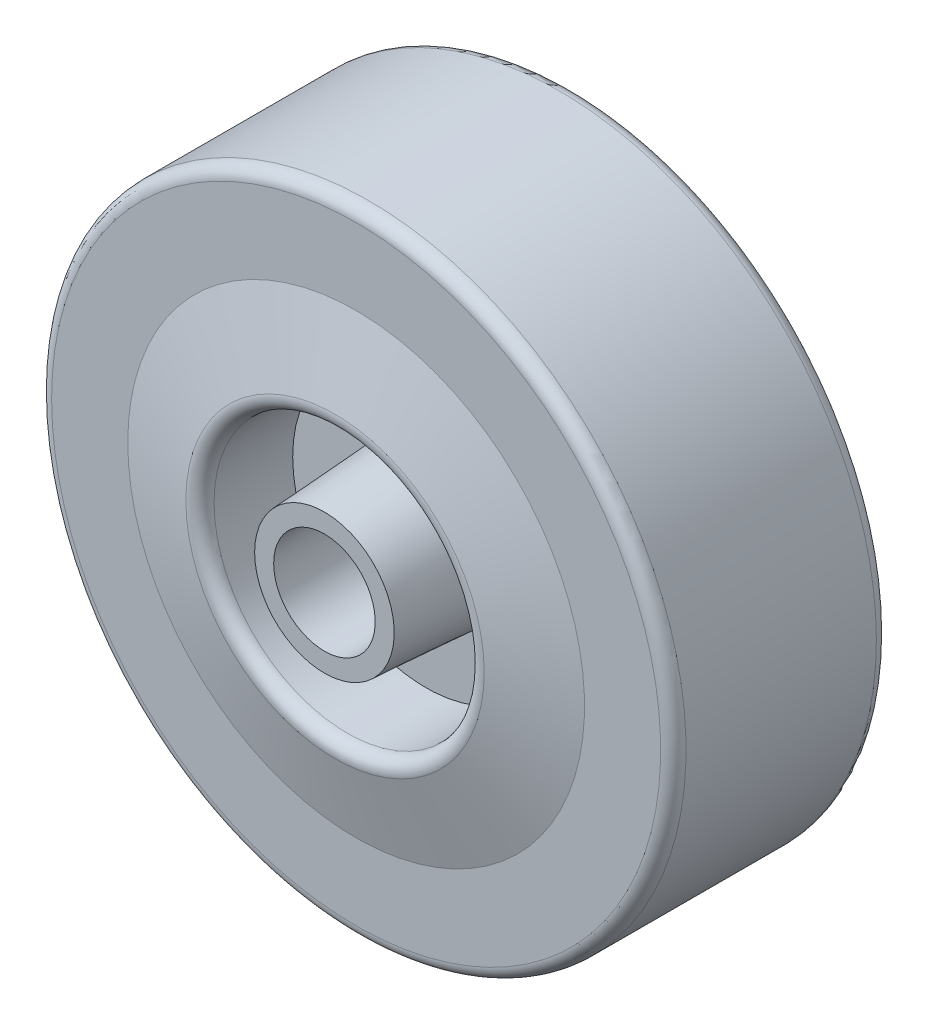
ISO-10303-21;
HEADER;
FILE_DESCRIPTION(('STEP AP214'),'2;1');
FILE_NAME('part.step','',(''),(''),'','','');
FILE_SCHEMA(('AUTOMOTIVE_DESIGN { 1 0 10303 214 1 1 1 1 }'));
ENDSEC;
DATA;
#1=APPLICATION_CONTEXT('core data for automotive mechanical design processes');
#2=APPLICATION_PROTOCOL_DEFINITION('international standard','automotive_design',2000,#1);
#3=PRODUCT_CONTEXT('',#1,'mechanical');
#4=PRODUCT('Part','Part','',(#3));
#5=PRODUCT_RELATED_PRODUCT_CATEGORY('part','',(#4));
#6=PRODUCT_DEFINITION_FORMATION('','',#4);
#7=PRODUCT_DEFINITION_CONTEXT('part definition',#1,'design');
#8=PRODUCT_DEFINITION('design','',#6,#7);
#9=PRODUCT_DEFINITION_SHAPE('','',#8);
#10=(LENGTH_UNIT() NAMED_UNIT(*) SI_UNIT(.MILLI.,.METRE.));
#11=(NAMED_UNIT(*) PLANE_ANGLE_UNIT() SI_UNIT($,.RADIAN.));
#12=(NAMED_UNIT(*) SI_UNIT($,.STERADIAN.) SOLID_ANGLE_UNIT());
#13=UNCERTAINTY_MEASURE_WITH_UNIT(LENGTH_MEASURE(1.E-05),#10,'distance_accuracy_value','');
#14=(GEOMETRIC_REPRESENTATION_CONTEXT(3) GLOBAL_UNCERTAINTY_ASSIGNED_CONTEXT((#13)) GLOBAL_UNIT_ASSIGNED_CONTEXT((#10,
#11,#12)) REPRESENTATION_CONTEXT('',''));
#15=CARTESIAN_POINT('',(0.,0.,0.));
#16=DIRECTION('',(0.,0.,1.));
#17=DIRECTION('',(1.,0.,0.));
#18=AXIS2_PLACEMENT_3D('',#15,#16,#17);
#19=CARTESIAN_POINT('',(4.,0.,-11.));
#20=DIRECTION('',(0.,0.,1.));
#21=DIRECTION('',(1.,0.,0.));
#22=AXIS2_PLACEMENT_3D('',#19,#20,#21);
#23=PLANE('',#22);
#24=CARTESIAN_POINT('',(0.,0.,-11.));
#25=DIRECTION('',(0.,0.,-1.));
#26=DIRECTION('',(-1.,0.,0.));
#27=AXIS2_PLACEMENT_3D('',#24,#25,#26);
#28=CIRCLE('',#27,4.);
#29=CARTESIAN_POINT('',(-4.,0.,-11.));
#30=VERTEX_POINT('',#29);
#31=EDGE_CURVE('E65',#30,#30,#28,.T.);
#32=ORIENTED_EDGE('',*,*,#31,.F.);
#33=EDGE_LOOP('',(#32));
#34=FACE_BOUND('',#33,.T.);
#35=CARTESIAN_POINT('',(0.,0.,-11.));
#36=DIRECTION('',(0.,0.,-1.));
#37=DIRECTION('',(-1.,0.,0.));
#38=AXIS2_PLACEMENT_3D('',#35,#36,#37);
#39=CIRCLE('',#38,5.5);
#40=CARTESIAN_POINT('',(-5.5,0.,-11.));
#41=VERTEX_POINT('',#40);
#42=EDGE_CURVE('E92',#41,#41,#39,.T.);
#43=ORIENTED_EDGE('',*,*,#42,.T.);
#44=EDGE_LOOP('',(#43));
#45=FACE_BOUND('',#44,.T.);
#46=ADVANCED_FACE('F33',(#34,#45),#23,.F.);
#47=CARTESIAN_POINT('',(0.,0.,-12.605103238958));
#48=DIRECTION('',(0.,0.,-1.));
#49=DIRECTION('',(-1.,0.,0.));
#50=AXIS2_PLACEMENT_3D('',#47,#48,#49);
#51=CYLINDRICAL_SURFACE('',#50,4.);
#52=CARTESIAN_POINT('',(0.,0.,11.));
#53=DIRECTION('',(0.,0.,-1.));
#54=DIRECTION('',(-1.,0.,0.));
#55=AXIS2_PLACEMENT_3D('',#52,#53,#54);
#56=CIRCLE('',#55,4.);
#57=CARTESIAN_POINT('',(-4.,0.,11.));
#58=VERTEX_POINT('',#57);
#59=EDGE_CURVE('E68',#58,#58,#56,.T.);
#60=ORIENTED_EDGE('',*,*,#59,.F.);
#61=EDGE_LOOP('',(#60));
#62=FACE_BOUND('',#61,.T.);
#63=ORIENTED_EDGE('',*,*,#31,.T.);
#64=EDGE_LOOP('',(#63));
#65=FACE_BOUND('',#64,.T.);
#66=ADVANCED_FACE('F122',(#62,#65),#51,.F.);
#67=CARTESIAN_POINT('',(4.,0.,11.));
#68=DIRECTION('',(0.,0.,-1.));
#69=DIRECTION('',(-1.,0.,0.));
#70=AXIS2_PLACEMENT_3D('',#67,#68,#69);
#71=PLANE('',#70);
#72=CARTESIAN_POINT('',(0.,0.,11.));
#73=DIRECTION('',(0.,0.,-1.));
#74=DIRECTION('',(-1.,0.,0.));
#75=AXIS2_PLACEMENT_3D('',#72,#73,#74);
#76=CIRCLE('',#75,5.5);
#77=CARTESIAN_POINT('',(-5.5,0.,11.));
#78=VERTEX_POINT('',#77);
#79=EDGE_CURVE('E71',#78,#78,#76,.T.);
#80=ORIENTED_EDGE('',*,*,#79,.F.);
#81=EDGE_LOOP('',(#80));
#82=FACE_BOUND('',#81,.T.);
#83=ORIENTED_EDGE('',*,*,#59,.T.);
#84=EDGE_LOOP('',(#83));
#85=FACE_BOUND('',#84,.T.);
#86=ADVANCED_FACE('F128',(#82,#85),#71,.F.);
#87=CARTESIAN_POINT('',(0.,0.,11.));
#88=DIRECTION('',(0.,0.,-1.));
#89=DIRECTION('',(-1.,0.,0.));
#90=AXIS2_PLACEMENT_3D('',#87,#88,#89);
#91=CONICAL_SURFACE('',#90,5.5,0.0624188099959575);
#92=CARTESIAN_POINT('',(0.,0.,3.));
#93=DIRECTION('',(0.,0.,-1.));
#94=DIRECTION('',(-1.,0.,0.));
#95=AXIS2_PLACEMENT_3D('',#92,#93,#94);
#96=CIRCLE('',#95,6.);
#97=CARTESIAN_POINT('',(-6.,0.,3.));
#98=VERTEX_POINT('',#97);
#99=EDGE_CURVE('E74',#98,#98,#96,.T.);
#100=ORIENTED_EDGE('',*,*,#99,.F.);
#101=EDGE_LOOP('',(#100));
#102=FACE_BOUND('',#101,.T.);
#103=ORIENTED_EDGE('',*,*,#79,.T.);
#104=EDGE_LOOP('',(#103));
#105=FACE_BOUND('',#104,.T.);
#106=ADVANCED_FACE('F176',(#102,#105),#91,.T.);
#107=CARTESIAN_POINT('',(6.,0.,3.));
#108=DIRECTION('',(0.,0.,-1.));
#109=DIRECTION('',(-1.,0.,0.));
#110=AXIS2_PLACEMENT_3D('',#107,#108,#109);
#111=PLANE('',#110);
#112=CARTESIAN_POINT('',(0.,0.,3.));
#113=DIRECTION('',(0.,0.,-1.));
#114=DIRECTION('',(-1.,0.,0.));
#115=AXIS2_PLACEMENT_3D('',#112,#113,#114);
#116=CIRCLE('',#115,10.5);
#117=CARTESIAN_POINT('',(-10.5,0.,3.));
#118=VERTEX_POINT('',#117);
#119=EDGE_CURVE('E77',#118,#118,#116,.T.);
#120=ORIENTED_EDGE('',*,*,#119,.F.);
#121=EDGE_LOOP('',(#120));
#122=FACE_BOUND('',#121,.T.);
#123=ORIENTED_EDGE('',*,*,#99,.T.);
#124=EDGE_LOOP('',(#123));
#125=FACE_BOUND('',#124,.T.);
#126=ADVANCED_FACE('F173',(#122,#125),#111,.F.);
#127=CARTESIAN_POINT('',(0.,0.,-12.605103238958));
#128=DIRECTION('',(0.,0.,-1.));
#129=DIRECTION('',(-1.,0.,0.));
#130=AXIS2_PLACEMENT_3D('',#127,#128,#129);
#131=CYLINDRICAL_SURFACE('',#130,10.5);
#132=CARTESIAN_POINT('',(0.,0.,9.19838835358267));
#133=DIRECTION('',(0.,0.,1.));
#134=DIRECTION('',(1.,0.,0.));
#135=AXIS2_PLACEMENT_3D('',#132,#133,#134);
#136=CIRCLE('',#135,10.5);
#137=CARTESIAN_POINT('',(10.5,0.,9.19838835358267));
#138=VERTEX_POINT('',#137);
#139=EDGE_CURVE('E10',#138,#138,#136,.T.);
#140=ORIENTED_EDGE('',*,*,#139,.T.);
#141=EDGE_LOOP('',(#140));
#142=FACE_BOUND('',#141,.T.);
#143=ORIENTED_EDGE('',*,*,#119,.T.);
#144=EDGE_LOOP('',(#143));
#145=FACE_BOUND('',#144,.T.);
#146=ADVANCED_FACE('F170',(#142,#145),#131,.F.);
#147=CARTESIAN_POINT('',(0.,0.,10.5));
#148=DIRECTION('',(0.,0.,-1.));
#149=DIRECTION('',(-1.,0.,0.));
#150=AXIS2_PLACEMENT_3D('',#147,#148,#149);
#151=CONICAL_SURFACE('',#150,10.5,1.31019393504756);
#152=CARTESIAN_POINT('',(0.,0.,10.1646232931839));
#153=DIRECTION('',(0.,0.,1.));
#154=DIRECTION('',(1.,0.,0.));
#155=AXIS2_PLACEMENT_3D('',#152,#153,#154);
#156=CIRCLE('',#155,11.7576626505603);
#157=CARTESIAN_POINT('',(11.7576626505603,0.,10.1646232931839));
#158=VERTEX_POINT('',#157);
#159=EDGE_CURVE('E40',#158,#158,#156,.F.);
#160=ORIENTED_EDGE('',*,*,#159,.T.);
#161=EDGE_LOOP('',(#160));
#162=FACE_BOUND('',#161,.T.);
#163=CARTESIAN_POINT('',(0.,0.,8.5));
#164=DIRECTION('',(0.,0.,-1.));
#165=DIRECTION('',(-1.,0.,0.));
#166=AXIS2_PLACEMENT_3D('',#163,#164,#165);
#167=CIRCLE('',#166,18.);
#168=CARTESIAN_POINT('',(-18.,0.,8.5));
#169=VERTEX_POINT('',#168);
#170=EDGE_CURVE('E80',#169,#169,#167,.T.);
#171=ORIENTED_EDGE('',*,*,#170,.F.);
#172=EDGE_LOOP('',(#171));
#173=FACE_BOUND('',#172,.T.);
#174=ADVANCED_FACE('F166',(#162,#173),#151,.T.);
#175=CARTESIAN_POINT('',(18.,0.,8.5));
#176=DIRECTION('',(0.,0.,-1.));
#177=DIRECTION('',(-1.,0.,0.));
#178=AXIS2_PLACEMENT_3D('',#175,#176,#177);
#179=PLANE('',#178);
#180=CARTESIAN_POINT('',(0.,0.,8.5));
#181=DIRECTION('',(0.,0.,-1.));
#182=DIRECTION('',(-1.,0.,0.));
#183=AXIS2_PLACEMENT_3D('',#180,#181,#182);
#184=CIRCLE('',#183,24.);
#185=CARTESIAN_POINT('',(-24.,0.,8.5));
#186=VERTEX_POINT('',#185);
#187=EDGE_CURVE('E56',#186,#186,#184,.F.);
#188=ORIENTED_EDGE('',*,*,#187,.T.);
#189=EDGE_LOOP('',(#188));
#190=FACE_BOUND('',#189,.T.);
#191=ORIENTED_EDGE('',*,*,#170,.T.);
#192=EDGE_LOOP('',(#191));
#193=FACE_BOUND('',#192,.T.);
#194=ADVANCED_FACE('F160',(#190,#193),#179,.F.);
#195=CARTESIAN_POINT('',(0.,0.,-12.605103238958));
#196=DIRECTION('',(0.,0.,-1.));
#197=DIRECTION('',(-1.,0.,0.));
#198=AXIS2_PLACEMENT_3D('',#195,#196,#197);
#199=CYLINDRICAL_SURFACE('',#198,25.);
#200=CARTESIAN_POINT('',(0.,0.,7.5));
#201=DIRECTION('',(0.,0.,-1.));
#202=DIRECTION('',(-1.,0.,0.));
#203=AXIS2_PLACEMENT_3D('',#200,#201,#202);
#204=CIRCLE('',#203,25.);
#205=CARTESIAN_POINT('',(-25.,0.,7.5));
#206=VERTEX_POINT('',#205);
#207=EDGE_CURVE('E59',#206,#206,#204,.T.);
#208=ORIENTED_EDGE('',*,*,#207,.T.);
#209=EDGE_LOOP('',(#208));
#210=FACE_BOUND('',#209,.T.);
#211=CARTESIAN_POINT('',(0.,0.,-7.5));
#212=DIRECTION('',(0.,0.,1.));
#213=DIRECTION('',(1.,0.,0.));
#214=AXIS2_PLACEMENT_3D('',#211,#212,#213);
#215=CIRCLE('',#214,25.);
#216=CARTESIAN_POINT('',(25.,0.,-7.5));
#217=VERTEX_POINT('',#216);
#218=EDGE_CURVE('E62',#217,#217,#215,.T.);
#219=ORIENTED_EDGE('',*,*,#218,.T.);
#220=EDGE_LOOP('',(#219));
#221=FACE_BOUND('',#220,.T.);
#222=ADVANCED_FACE('F154',(#210,#221),#199,.T.);
#223=CARTESIAN_POINT('',(18.,0.,-8.5));
#224=DIRECTION('',(0.,0.,1.));
#225=DIRECTION('',(1.,0.,0.));
#226=AXIS2_PLACEMENT_3D('',#223,#224,#225);
#227=PLANE('',#226);
#228=CARTESIAN_POINT('',(0.,0.,-8.5));
#229=DIRECTION('',(0.,0.,1.));
#230=DIRECTION('',(1.,0.,0.));
#231=AXIS2_PLACEMENT_3D('',#228,#229,#230);
#232=CIRCLE('',#231,24.);
#233=CARTESIAN_POINT('',(24.,0.,-8.5));
#234=VERTEX_POINT('',#233);
#235=EDGE_CURVE('E53',#234,#234,#232,.F.);
#236=ORIENTED_EDGE('',*,*,#235,.T.);
#237=EDGE_LOOP('',(#236));
#238=FACE_BOUND('',#237,.T.);
#239=CARTESIAN_POINT('',(0.,0.,-8.5));
#240=DIRECTION('',(0.,0.,-1.));
#241=DIRECTION('',(-1.,0.,0.));
#242=AXIS2_PLACEMENT_3D('',#239,#240,#241);
#243=CIRCLE('',#242,18.);
#244=CARTESIAN_POINT('',(-18.,0.,-8.5));
#245=VERTEX_POINT('',#244);
#246=EDGE_CURVE('E83',#245,#245,#243,.T.);
#247=ORIENTED_EDGE('',*,*,#246,.F.);
#248=EDGE_LOOP('',(#247));
#249=FACE_BOUND('',#248,.T.);
#250=ADVANCED_FACE('F118',(#238,#249),#227,.F.);
#251=CARTESIAN_POINT('',(0.,0.,-8.5));
#252=DIRECTION('',(0.,0.,1.));
#253=DIRECTION('',(1.,0.,0.));
#254=AXIS2_PLACEMENT_3D('',#251,#252,#253);
#255=CONICAL_SURFACE('',#254,18.,1.31019393504756);
#256=CARTESIAN_POINT('',(0.,0.,-10.1646232931839));
#257=DIRECTION('',(0.,0.,-1.));
#258=DIRECTION('',(-1.,0.,0.));
#259=AXIS2_PLACEMENT_3D('',#256,#257,#258);
#260=CIRCLE('',#259,11.7576626505603);
#261=CARTESIAN_POINT('',(-11.7576626505603,0.,-10.1646232931839));
#262=VERTEX_POINT('',#261);
#263=EDGE_CURVE('E44',#262,#262,#260,.F.);
#264=ORIENTED_EDGE('',*,*,#263,.T.);
#265=EDGE_LOOP('',(#264));
#266=FACE_BOUND('',#265,.T.);
#267=ORIENTED_EDGE('',*,*,#246,.T.);
#268=EDGE_LOOP('',(#267));
#269=FACE_BOUND('',#268,.T.);
#270=ADVANCED_FACE('F112',(#266,#269),#255,.T.);
#271=CARTESIAN_POINT('',(0.,0.,-12.605103238958));
#272=DIRECTION('',(0.,0.,-1.));
#273=DIRECTION('',(-1.,0.,0.));
#274=AXIS2_PLACEMENT_3D('',#271,#272,#273);
#275=CYLINDRICAL_SURFACE('',#274,10.5);
#276=CARTESIAN_POINT('',(0.,0.,-9.19838835358266));
#277=DIRECTION('',(0.,0.,1.));
#278=DIRECTION('',(1.,0.,0.));
#279=AXIS2_PLACEMENT_3D('',#276,#277,#278);
#280=CIRCLE('',#279,10.5);
#281=CARTESIAN_POINT('',(10.5,0.,-9.19838835358266));
#282=VERTEX_POINT('',#281);
#283=EDGE_CURVE('E48',#282,#282,#280,.F.);
#284=ORIENTED_EDGE('',*,*,#283,.T.);
#285=EDGE_LOOP('',(#284));
#286=FACE_BOUND('',#285,.T.);
#287=CARTESIAN_POINT('',(0.,0.,-3.));
#288=DIRECTION('',(0.,0.,-1.));
#289=DIRECTION('',(-1.,0.,0.));
#290=AXIS2_PLACEMENT_3D('',#287,#288,#289);
#291=CIRCLE('',#290,10.5);
#292=CARTESIAN_POINT('',(-10.5,0.,-3.));
#293=VERTEX_POINT('',#292);
#294=EDGE_CURVE('E86',#293,#293,#291,.T.);
#295=ORIENTED_EDGE('',*,*,#294,.F.);
#296=EDGE_LOOP('',(#295));
#297=FACE_BOUND('',#296,.T.);
#298=ADVANCED_FACE('F107',(#286,#297),#275,.F.);
#299=CARTESIAN_POINT('',(6.,0.,-3.));
#300=DIRECTION('',(0.,0.,1.));
#301=DIRECTION('',(1.,0.,0.));
#302=AXIS2_PLACEMENT_3D('',#299,#300,#301);
#303=PLANE('',#302);
#304=CARTESIAN_POINT('',(0.,0.,-3.));
#305=DIRECTION('',(0.,0.,-1.));
#306=DIRECTION('',(-1.,0.,0.));
#307=AXIS2_PLACEMENT_3D('',#304,#305,#306);
#308=CIRCLE('',#307,6.);
#309=CARTESIAN_POINT('',(-6.,0.,-3.));
#310=VERTEX_POINT('',#309);
#311=EDGE_CURVE('E89',#310,#310,#308,.T.);
#312=ORIENTED_EDGE('',*,*,#311,.F.);
#313=EDGE_LOOP('',(#312));
#314=FACE_BOUND('',#313,.T.);
#315=ORIENTED_EDGE('',*,*,#294,.T.);
#316=EDGE_LOOP('',(#315));
#317=FACE_BOUND('',#316,.T.);
#318=ADVANCED_FACE('F101',(#314,#317),#303,.F.);
#319=CARTESIAN_POINT('',(0.,0.,-3.));
#320=DIRECTION('',(0.,0.,1.));
#321=DIRECTION('',(1.,0.,0.));
#322=AXIS2_PLACEMENT_3D('',#319,#320,#321);
#323=CONICAL_SURFACE('',#322,6.,0.0624188099959577);
#324=ORIENTED_EDGE('',*,*,#42,.F.);
#325=EDGE_LOOP('',(#324));
#326=FACE_BOUND('',#325,.T.);
#327=ORIENTED_EDGE('',*,*,#311,.T.);
#328=EDGE_LOOP('',(#327));
#329=FACE_BOUND('',#328,.T.);
#330=ADVANCED_FACE('F97',(#326,#329),#323,.T.);
#331=CARTESIAN_POINT('',(0.,0.,7.5));
#332=DIRECTION('',(0.,0.,-1.));
#333=DIRECTION('',(-1.,0.,0.));
#334=AXIS2_PLACEMENT_3D('',#331,#332,#333);
#335=TOROIDAL_SURFACE('',#334,24.,1.);
#336=ORIENTED_EDGE('',*,*,#187,.F.);
#337=EDGE_LOOP('',(#336));
#338=FACE_BOUND('',#337,.T.);
#339=ORIENTED_EDGE('',*,*,#207,.F.);
#340=EDGE_LOOP('',(#339));
#341=FACE_BOUND('',#340,.T.);
#342=ADVANCED_FACE('F100',(#338,#341),#335,.T.);
#343=CARTESIAN_POINT('',(0.,0.,-7.5));
#344=DIRECTION('',(0.,0.,1.));
#345=DIRECTION('',(1.,0.,0.));
#346=AXIS2_PLACEMENT_3D('',#343,#344,#345);
#347=TOROIDAL_SURFACE('',#346,24.,1.);
#348=ORIENTED_EDGE('',*,*,#218,.F.);
#349=EDGE_LOOP('',(#348));
#350=FACE_BOUND('',#349,.T.);
#351=ORIENTED_EDGE('',*,*,#235,.F.);
#352=EDGE_LOOP('',(#351));
#353=FACE_BOUND('',#352,.T.);
#354=ADVANCED_FACE('F136',(#350,#353),#347,.T.);
#355=CARTESIAN_POINT('',(0.,0.,-9.19838835358266));
#356=DIRECTION('',(0.,0.,1.));
#357=DIRECTION('',(1.,0.,0.));
#358=AXIS2_PLACEMENT_3D('',#355,#356,#357);
#359=TOROIDAL_SURFACE('',#358,11.5,1.);
#360=ORIENTED_EDGE('',*,*,#263,.F.);
#361=EDGE_LOOP('',(#360));
#362=FACE_BOUND('',#361,.T.);
#363=ORIENTED_EDGE('',*,*,#283,.F.);
#364=EDGE_LOOP('',(#363));
#365=FACE_BOUND('',#364,.T.);
#366=ADVANCED_FACE('F139',(#362,#365),#359,.T.);
#367=CARTESIAN_POINT('',(0.,0.,9.19838835358267));
#368=DIRECTION('',(0.,0.,1.));
#369=DIRECTION('',(1.,0.,0.));
#370=AXIS2_PLACEMENT_3D('',#367,#368,#369);
#371=TOROIDAL_SURFACE('',#370,11.5,1.);
#372=ORIENTED_EDGE('',*,*,#139,.F.);
#373=EDGE_LOOP('',(#372));
#374=FACE_BOUND('',#373,.T.);
#375=ORIENTED_EDGE('',*,*,#159,.F.);
#376=EDGE_LOOP('',(#375));
#377=FACE_BOUND('',#376,.T.);
#378=ADVANCED_FACE('F35',(#374,#377),#371,.T.);
#379=CLOSED_SHELL('',(#46,#66,#86,#106,#126,#146,#174,#194,#222,#250,#270,#298,#318,#330,#342,
#354,#366,#378));
#380=MANIFOLD_SOLID_BREP('B2',#379);
#381=ADVANCED_BREP_SHAPE_REPRESENTATION('',(#18,#380),#14);
#382=SHAPE_DEFINITION_REPRESENTATION(#9,#381);
ENDSEC;
END-ISO-10303-21;
